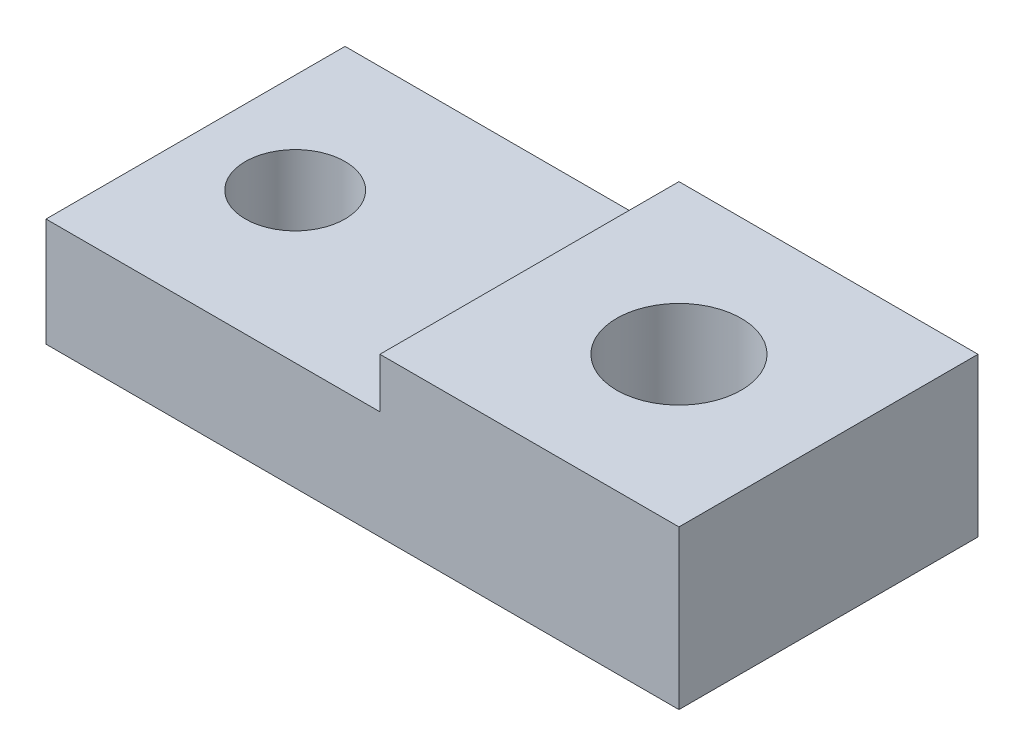
ISO-10303-21;
HEADER;
FILE_DESCRIPTION(('STEP AP214'),'2;1');
FILE_NAME('part.step','',(''),(''),'','','');
FILE_SCHEMA(('AUTOMOTIVE_DESIGN { 1 0 10303 214 1 1 1 1 }'));
ENDSEC;
DATA;
#1=APPLICATION_CONTEXT('core data for automotive mechanical design processes');
#2=APPLICATION_PROTOCOL_DEFINITION('international standard','automotive_design',2000,#1);
#3=PRODUCT_CONTEXT('',#1,'mechanical');
#4=PRODUCT('Part','Part','',(#3));
#5=PRODUCT_RELATED_PRODUCT_CATEGORY('part','',(#4));
#6=PRODUCT_DEFINITION_FORMATION('','',#4);
#7=PRODUCT_DEFINITION_CONTEXT('part definition',#1,'design');
#8=PRODUCT_DEFINITION('design','',#6,#7);
#9=PRODUCT_DEFINITION_SHAPE('','',#8);
#10=(LENGTH_UNIT() NAMED_UNIT(*) SI_UNIT(.MILLI.,.METRE.));
#11=(NAMED_UNIT(*) PLANE_ANGLE_UNIT() SI_UNIT($,.RADIAN.));
#12=(NAMED_UNIT(*) SI_UNIT($,.STERADIAN.) SOLID_ANGLE_UNIT());
#13=UNCERTAINTY_MEASURE_WITH_UNIT(LENGTH_MEASURE(1.E-05),#10,'distance_accuracy_value','');
#14=(GEOMETRIC_REPRESENTATION_CONTEXT(3) GLOBAL_UNCERTAINTY_ASSIGNED_CONTEXT((#13)) GLOBAL_UNIT_ASSIGNED_CONTEXT((#10,
#11,#12)) REPRESENTATION_CONTEXT('',''));
#15=CARTESIAN_POINT('',(0.,0.,0.));
#16=DIRECTION('',(0.,0.,1.));
#17=DIRECTION('',(1.,0.,0.));
#18=AXIS2_PLACEMENT_3D('',#15,#16,#17);
#19=CARTESIAN_POINT('',(6.34999999999999,1.5875,3.));
#20=DIRECTION('',(-1.,0.,0.));
#21=DIRECTION('',(0.,0.,1.));
#22=AXIS2_PLACEMENT_3D('',#19,#20,#21);
#23=PLANE('',#22);
#24=DIRECTION('',(0.,0.,-1.));
#25=VECTOR('',#24,1.);
#26=CARTESIAN_POINT('',(6.34999999999999,-1.5875,3.));
#27=LINE('',#26,#25);
#28=CARTESIAN_POINT('',(6.34999999999999,-1.5875,3.));
#29=VERTEX_POINT('',#28);
#30=CARTESIAN_POINT('',(6.34999999999999,-1.5875,-3.));
#31=VERTEX_POINT('',#30);
#32=EDGE_CURVE('E107',#29,#31,#27,.T.);
#33=ORIENTED_EDGE('',*,*,#32,.T.);
#34=DIRECTION('',(0.,-1.,0.));
#35=VECTOR('',#34,1.);
#36=CARTESIAN_POINT('',(6.34999999999999,1.5875,-3.));
#37=LINE('',#36,#35);
#38=CARTESIAN_POINT('',(6.34999999999999,1.5875,-3.));
#39=VERTEX_POINT('',#38);
#40=EDGE_CURVE('E11',#39,#31,#37,.T.);
#41=ORIENTED_EDGE('',*,*,#40,.F.);
#42=DIRECTION('',(0.,0.,-1.));
#43=VECTOR('',#42,1.);
#44=CARTESIAN_POINT('',(6.34999999999999,1.5875,3.));
#45=LINE('',#44,#43);
#46=CARTESIAN_POINT('',(6.34999999999999,1.5875,3.));
#47=VERTEX_POINT('',#46);
#48=EDGE_CURVE('E101',#47,#39,#45,.T.);
#49=ORIENTED_EDGE('',*,*,#48,.F.);
#50=DIRECTION('',(0.,-1.,0.));
#51=VECTOR('',#50,1.);
#52=CARTESIAN_POINT('',(6.34999999999999,1.5875,3.));
#53=LINE('',#52,#51);
#54=EDGE_CURVE('E91',#47,#29,#53,.T.);
#55=ORIENTED_EDGE('',*,*,#54,.T.);
#56=EDGE_LOOP('',(#33,#41,#49,#55));
#57=FACE_BOUND('',#56,.T.);
#58=ADVANCED_FACE('F46',(#57),#23,.F.);
#59=CARTESIAN_POINT('',(-6.35000000000001,1.5875,-3.));
#60=DIRECTION('',(0.,0.,1.));
#61=DIRECTION('',(1.,0.,0.));
#62=AXIS2_PLACEMENT_3D('',#59,#60,#61);
#63=PLANE('',#62);
#64=DIRECTION('',(1.,0.,0.));
#65=VECTOR('',#64,1.);
#66=CARTESIAN_POINT('',(-6.35000000000001,0.5875,-3.));
#67=LINE('',#66,#65);
#68=CARTESIAN_POINT('',(-6.35000000000001,0.5875,-3.));
#69=VERTEX_POINT('',#68);
#70=CARTESIAN_POINT('',(0.349999999999987,0.5875,-3.));
#71=VERTEX_POINT('',#70);
#72=EDGE_CURVE('E162',#69,#71,#67,.T.);
#73=ORIENTED_EDGE('',*,*,#72,.T.);
#74=DIRECTION('',(0.,1.,0.));
#75=VECTOR('',#74,1.);
#76=CARTESIAN_POINT('',(0.349999999999987,1.5875,-3.));
#77=LINE('',#76,#75);
#78=CARTESIAN_POINT('',(0.349999999999987,1.5875,-3.));
#79=VERTEX_POINT('',#78);
#80=EDGE_CURVE('E143',#71,#79,#77,.T.);
#81=ORIENTED_EDGE('',*,*,#80,.T.);
#82=DIRECTION('',(-1.,0.,0.));
#83=VECTOR('',#82,1.);
#84=CARTESIAN_POINT('',(-6.35000000000001,1.5875,-3.));
#85=LINE('',#84,#83);
#86=EDGE_CURVE('E141',#39,#79,#85,.T.);
#87=ORIENTED_EDGE('',*,*,#86,.F.);
#88=ORIENTED_EDGE('',*,*,#40,.T.);
#89=DIRECTION('',(-1.,0.,0.));
#90=VECTOR('',#89,1.);
#91=CARTESIAN_POINT('',(-6.35000000000001,-1.5875,-3.));
#92=LINE('',#91,#90);
#93=CARTESIAN_POINT('',(-6.35000000000001,-1.5875,-3.));
#94=VERTEX_POINT('',#93);
#95=EDGE_CURVE('E112',#31,#94,#92,.T.);
#96=ORIENTED_EDGE('',*,*,#95,.T.);
#97=DIRECTION('',(0.,-1.,0.));
#98=VECTOR('',#97,1.);
#99=CARTESIAN_POINT('',(-6.35000000000001,1.5875,-3.));
#100=LINE('',#99,#98);
#101=EDGE_CURVE('E54',#69,#94,#100,.T.);
#102=ORIENTED_EDGE('',*,*,#101,.F.);
#103=EDGE_LOOP('',(#73,#81,#87,#88,#96,#102));
#104=FACE_BOUND('',#103,.T.);
#105=ADVANCED_FACE('F138',(#104),#63,.F.);
#106=CARTESIAN_POINT('',(-6.35000000000001,1.5875,3.));
#107=DIRECTION('',(1.,0.,0.));
#108=DIRECTION('',(0.,0.,-1.));
#109=AXIS2_PLACEMENT_3D('',#106,#107,#108);
#110=PLANE('',#109);
#111=DIRECTION('',(0.,-1.,0.));
#112=VECTOR('',#111,1.);
#113=CARTESIAN_POINT('',(-6.35000000000001,1.5875,3.));
#114=LINE('',#113,#112);
#115=CARTESIAN_POINT('',(-6.35000000000001,0.5875,3.));
#116=VERTEX_POINT('',#115);
#117=CARTESIAN_POINT('',(-6.35000000000001,-1.5875,3.));
#118=VERTEX_POINT('',#117);
#119=EDGE_CURVE('E95',#116,#118,#114,.T.);
#120=ORIENTED_EDGE('',*,*,#119,.F.);
#121=DIRECTION('',(0.,0.,1.));
#122=VECTOR('',#121,1.);
#123=CARTESIAN_POINT('',(-6.35000000000001,0.5875,-3.));
#124=LINE('',#123,#122);
#125=EDGE_CURVE('E135',#69,#116,#124,.T.);
#126=ORIENTED_EDGE('',*,*,#125,.F.);
#127=ORIENTED_EDGE('',*,*,#101,.T.);
#128=DIRECTION('',(0.,0.,1.));
#129=VECTOR('',#128,1.);
#130=CARTESIAN_POINT('',(-6.35000000000001,-1.5875,3.));
#131=LINE('',#130,#129);
#132=EDGE_CURVE('E102',#94,#118,#131,.T.);
#133=ORIENTED_EDGE('',*,*,#132,.T.);
#134=EDGE_LOOP('',(#120,#126,#127,#133));
#135=FACE_BOUND('',#134,.T.);
#136=ADVANCED_FACE('F132',(#135),#110,.F.);
#137=CARTESIAN_POINT('',(-6.35000000000001,1.5875,3.));
#138=DIRECTION('',(0.,0.,-1.));
#139=DIRECTION('',(-1.,0.,0.));
#140=AXIS2_PLACEMENT_3D('',#137,#138,#139);
#141=PLANE('',#140);
#142=DIRECTION('',(1.,0.,0.));
#143=VECTOR('',#142,1.);
#144=CARTESIAN_POINT('',(-6.35000000000001,1.5875,3.));
#145=LINE('',#144,#143);
#146=CARTESIAN_POINT('',(0.349999999999987,1.5875,3.));
#147=VERTEX_POINT('',#146);
#148=EDGE_CURVE('E69',#147,#47,#145,.T.);
#149=ORIENTED_EDGE('',*,*,#148,.F.);
#150=DIRECTION('',(0.,1.,0.));
#151=VECTOR('',#150,1.);
#152=CARTESIAN_POINT('',(0.349999999999987,1.5875,3.));
#153=LINE('',#152,#151);
#154=CARTESIAN_POINT('',(0.349999999999987,0.5875,3.));
#155=VERTEX_POINT('',#154);
#156=EDGE_CURVE('E61',#155,#147,#153,.T.);
#157=ORIENTED_EDGE('',*,*,#156,.F.);
#158=DIRECTION('',(1.,0.,0.));
#159=VECTOR('',#158,1.);
#160=CARTESIAN_POINT('',(-6.35000000000001,0.5875,3.));
#161=LINE('',#160,#159);
#162=EDGE_CURVE('E163',#116,#155,#161,.T.);
#163=ORIENTED_EDGE('',*,*,#162,.F.);
#164=ORIENTED_EDGE('',*,*,#119,.T.);
#165=DIRECTION('',(1.,0.,0.));
#166=VECTOR('',#165,1.);
#167=CARTESIAN_POINT('',(-6.35000000000001,-1.5875,3.));
#168=LINE('',#167,#166);
#169=EDGE_CURVE('E88',#118,#29,#168,.T.);
#170=ORIENTED_EDGE('',*,*,#169,.T.);
#171=ORIENTED_EDGE('',*,*,#54,.F.);
#172=EDGE_LOOP('',(#149,#157,#163,#164,#170,#171));
#173=FACE_BOUND('',#172,.T.);
#174=ADVANCED_FACE('F90',(#173),#141,.F.);
#175=CARTESIAN_POINT('',(0.,1.5875,0.));
#176=DIRECTION('',(0.,-1.,0.));
#177=DIRECTION('',(0.,0.,-1.));
#178=AXIS2_PLACEMENT_3D('',#175,#176,#177);
#179=PLANE('',#178);
#180=CARTESIAN_POINT('',(3.35,1.5875,0.));
#181=DIRECTION('',(0.,1.,0.));
#182=DIRECTION('',(0.,0.,1.));
#183=AXIS2_PLACEMENT_3D('',#180,#181,#182);
#184=CIRCLE('',#183,1.24999999999999);
#185=CARTESIAN_POINT('',(3.35,1.5875,1.24999999999999));
#186=VERTEX_POINT('',#185);
#187=EDGE_CURVE('E120',#186,#186,#184,.T.);
#188=ORIENTED_EDGE('',*,*,#187,.F.);
#189=EDGE_LOOP('',(#188));
#190=FACE_BOUND('',#189,.T.);
#191=ORIENTED_EDGE('',*,*,#86,.T.);
#192=DIRECTION('',(0.,0.,1.));
#193=VECTOR('',#192,1.);
#194=CARTESIAN_POINT('',(0.349999999999987,1.5875,-3.));
#195=LINE('',#194,#193);
#196=EDGE_CURVE('E152',#79,#147,#195,.T.);
#197=ORIENTED_EDGE('',*,*,#196,.T.);
#198=ORIENTED_EDGE('',*,*,#148,.T.);
#199=ORIENTED_EDGE('',*,*,#48,.T.);
#200=EDGE_LOOP('',(#191,#197,#198,#199));
#201=FACE_BOUND('',#200,.T.);
#202=ADVANCED_FACE('F145',(#190,#201),#179,.F.);
#203=CARTESIAN_POINT('',(0.,-1.5875,0.));
#204=DIRECTION('',(0.,-1.,0.));
#205=DIRECTION('',(0.,0.,-1.));
#206=AXIS2_PLACEMENT_3D('',#203,#204,#205);
#207=PLANE('',#206);
#208=CARTESIAN_POINT('',(-4.35000000000001,-1.5875,0.));
#209=DIRECTION('',(0.,1.,0.));
#210=DIRECTION('',(0.,0.,1.));
#211=AXIS2_PLACEMENT_3D('',#208,#209,#210);
#212=CIRCLE('',#211,1.);
#213=CARTESIAN_POINT('',(-4.35000000000001,-1.5875,1.));
#214=VERTEX_POINT('',#213);
#215=EDGE_CURVE('E167',#214,#214,#212,.T.);
#216=ORIENTED_EDGE('',*,*,#215,.T.);
#217=EDGE_LOOP('',(#216));
#218=FACE_BOUND('',#217,.T.);
#219=CARTESIAN_POINT('',(3.35,-1.5875,0.));
#220=DIRECTION('',(0.,1.,0.));
#221=DIRECTION('',(0.,0.,1.));
#222=AXIS2_PLACEMENT_3D('',#219,#220,#221);
#223=CIRCLE('',#222,1.25);
#224=CARTESIAN_POINT('',(3.35,-1.5875,1.25));
#225=VERTEX_POINT('',#224);
#226=EDGE_CURVE('E114',#225,#225,#223,.T.);
#227=ORIENTED_EDGE('',*,*,#226,.T.);
#228=EDGE_LOOP('',(#227));
#229=FACE_BOUND('',#228,.T.);
#230=ORIENTED_EDGE('',*,*,#32,.F.);
#231=ORIENTED_EDGE('',*,*,#169,.F.);
#232=ORIENTED_EDGE('',*,*,#132,.F.);
#233=ORIENTED_EDGE('',*,*,#95,.F.);
#234=EDGE_LOOP('',(#230,#231,#232,#233));
#235=FACE_BOUND('',#234,.T.);
#236=ADVANCED_FACE('F110',(#218,#229,#235),#207,.T.);
#237=CARTESIAN_POINT('',(3.35,1.5875,0.));
#238=DIRECTION('',(0.,1.,0.));
#239=DIRECTION('',(0.,0.,1.));
#240=AXIS2_PLACEMENT_3D('',#237,#238,#239);
#241=CYLINDRICAL_SURFACE('',#240,1.24999999999999);
#242=ORIENTED_EDGE('',*,*,#226,.F.);
#243=EDGE_LOOP('',(#242));
#244=FACE_BOUND('',#243,.T.);
#245=ORIENTED_EDGE('',*,*,#187,.T.);
#246=EDGE_LOOP('',(#245));
#247=FACE_BOUND('',#246,.T.);
#248=ADVANCED_FACE('F204',(#244,#247),#241,.F.);
#249=CARTESIAN_POINT('',(0.349999999999987,1.5875,-3.));
#250=DIRECTION('',(1.,0.,0.));
#251=DIRECTION('',(0.,0.,-1.));
#252=AXIS2_PLACEMENT_3D('',#249,#250,#251);
#253=PLANE('',#252);
#254=ORIENTED_EDGE('',*,*,#156,.T.);
#255=ORIENTED_EDGE('',*,*,#196,.F.);
#256=ORIENTED_EDGE('',*,*,#80,.F.);
#257=DIRECTION('',(0.,0.,1.));
#258=VECTOR('',#257,1.);
#259=CARTESIAN_POINT('',(0.349999999999987,0.5875,-3.));
#260=LINE('',#259,#258);
#261=EDGE_CURVE('E155',#71,#155,#260,.T.);
#262=ORIENTED_EDGE('',*,*,#261,.T.);
#263=EDGE_LOOP('',(#254,#255,#256,#262));
#264=FACE_BOUND('',#263,.T.);
#265=ADVANCED_FACE('F191',(#264),#253,.F.);
#266=CARTESIAN_POINT('',(-6.35000000000001,0.5875,-3.));
#267=DIRECTION('',(0.,-1.,0.));
#268=DIRECTION('',(0.,0.,-1.));
#269=AXIS2_PLACEMENT_3D('',#266,#267,#268);
#270=PLANE('',#269);
#271=CARTESIAN_POINT('',(-4.35000000000001,0.5875,0.));
#272=DIRECTION('',(0.,1.,0.));
#273=DIRECTION('',(0.,0.,1.));
#274=AXIS2_PLACEMENT_3D('',#271,#272,#273);
#275=CIRCLE('',#274,1.);
#276=CARTESIAN_POINT('',(-4.35000000000001,0.5875,1.));
#277=VERTEX_POINT('',#276);
#278=EDGE_CURVE('E172',#277,#277,#275,.T.);
#279=ORIENTED_EDGE('',*,*,#278,.F.);
#280=EDGE_LOOP('',(#279));
#281=FACE_BOUND('',#280,.T.);
#282=ORIENTED_EDGE('',*,*,#162,.T.);
#283=ORIENTED_EDGE('',*,*,#261,.F.);
#284=ORIENTED_EDGE('',*,*,#72,.F.);
#285=ORIENTED_EDGE('',*,*,#125,.T.);
#286=EDGE_LOOP('',(#282,#283,#284,#285));
#287=FACE_BOUND('',#286,.T.);
#288=ADVANCED_FACE('F185',(#281,#287),#270,.F.);
#289=CARTESIAN_POINT('',(-4.35000000000001,-1.5875,0.));
#290=DIRECTION('',(0.,1.,0.));
#291=DIRECTION('',(0.,0.,1.));
#292=AXIS2_PLACEMENT_3D('',#289,#290,#291);
#293=CYLINDRICAL_SURFACE('',#292,1.);
#294=ORIENTED_EDGE('',*,*,#215,.F.);
#295=EDGE_LOOP('',(#294));
#296=FACE_BOUND('',#295,.T.);
#297=ORIENTED_EDGE('',*,*,#278,.T.);
#298=EDGE_LOOP('',(#297));
#299=FACE_BOUND('',#298,.T.);
#300=ADVANCED_FACE('F182',(#296,#299),#293,.F.);
#301=CLOSED_SHELL('',(#58,#105,#136,#174,#202,#236,#248,#265,#288,#300));
#302=MANIFOLD_SOLID_BREP('B2',#301);
#303=ADVANCED_BREP_SHAPE_REPRESENTATION('',(#18,#302),#14);
#304=SHAPE_DEFINITION_REPRESENTATION(#9,#303);
ENDSEC;
END-ISO-10303-21;
